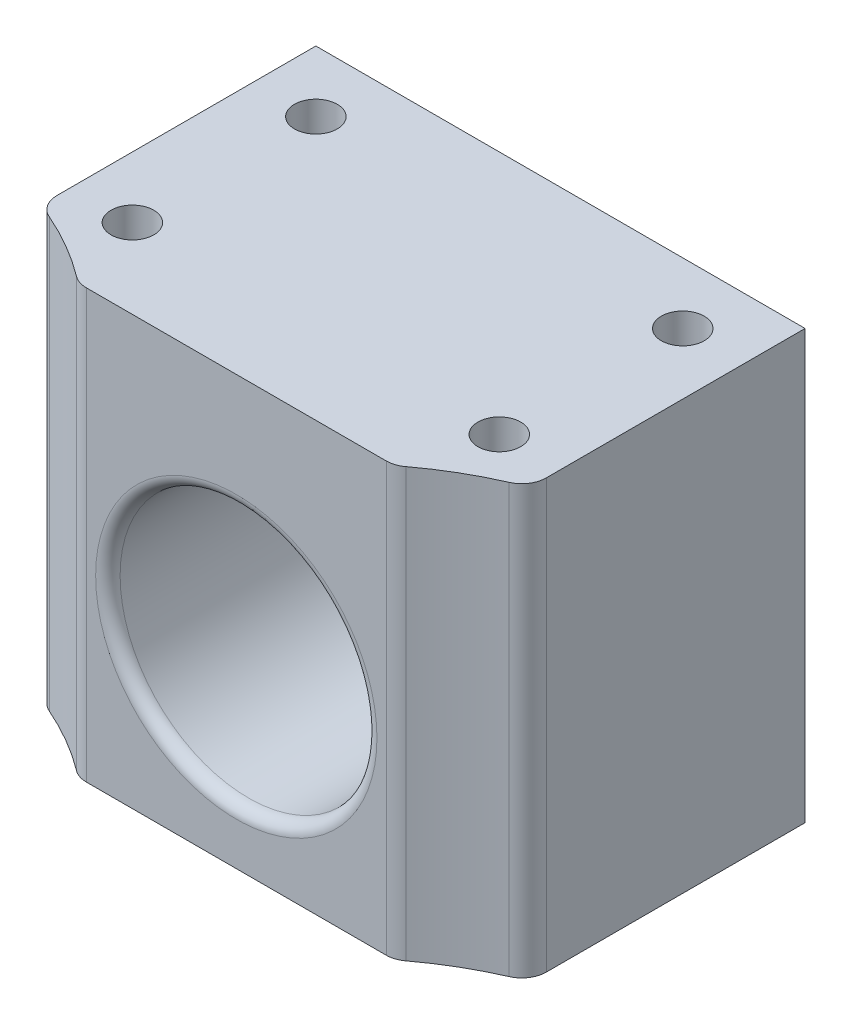
ISO-10303-21;
HEADER;
FILE_DESCRIPTION(('STEP AP214'),'2;1');
FILE_NAME('part.step','',(''),(''),'','','');
FILE_SCHEMA(('AUTOMOTIVE_DESIGN { 1 0 10303 214 1 1 1 1 }'));
ENDSEC;
DATA;
#1=APPLICATION_CONTEXT('core data for automotive mechanical design processes');
#2=APPLICATION_PROTOCOL_DEFINITION('international standard','automotive_design',2000,#1);
#3=PRODUCT_CONTEXT('',#1,'mechanical');
#4=PRODUCT('Part','Part','',(#3));
#5=PRODUCT_RELATED_PRODUCT_CATEGORY('part','',(#4));
#6=PRODUCT_DEFINITION_FORMATION('','',#4);
#7=PRODUCT_DEFINITION_CONTEXT('part definition',#1,'design');
#8=PRODUCT_DEFINITION('design','',#6,#7);
#9=PRODUCT_DEFINITION_SHAPE('','',#8);
#10=(LENGTH_UNIT() NAMED_UNIT(*) SI_UNIT(.MILLI.,.METRE.));
#11=(NAMED_UNIT(*) PLANE_ANGLE_UNIT() SI_UNIT($,.RADIAN.));
#12=(NAMED_UNIT(*) SI_UNIT($,.STERADIAN.) SOLID_ANGLE_UNIT());
#13=UNCERTAINTY_MEASURE_WITH_UNIT(LENGTH_MEASURE(1.E-05),#10,'distance_accuracy_value','');
#14=(GEOMETRIC_REPRESENTATION_CONTEXT(3) GLOBAL_UNCERTAINTY_ASSIGNED_CONTEXT((#13)) GLOBAL_UNIT_ASSIGNED_CONTEXT((#10,
#11,#12)) REPRESENTATION_CONTEXT('',''));
#15=CARTESIAN_POINT('',(0.,0.,0.));
#16=DIRECTION('',(0.,0.,1.));
#17=DIRECTION('',(1.,0.,0.));
#18=AXIS2_PLACEMENT_3D('',#15,#16,#17);
#19=CARTESIAN_POINT('',(-20.,35.,-13.25250025005));
#20=DIRECTION('',(0.,0.,1.));
#21=DIRECTION('',(1.,0.,0.));
#22=AXIS2_PLACEMENT_3D('',#19,#20,#21);
#23=PLANE('',#22);
#24=CARTESIAN_POINT('',(0.,15.,-13.25250025005));
#25=DIRECTION('',(0.,0.,1.));
#26=DIRECTION('',(1.,0.,0.));
#27=AXIS2_PLACEMENT_3D('',#24,#25,#26);
#28=CIRCLE('',#27,11.5);
#29=CARTESIAN_POINT('',(11.5,15.,-13.25250025005));
#30=VERTEX_POINT('',#29);
#31=EDGE_CURVE('E44',#30,#30,#28,.T.);
#32=ORIENTED_EDGE('',*,*,#31,.T.);
#33=EDGE_LOOP('',(#32));
#34=FACE_BOUND('',#33,.T.);
#35=DIRECTION('',(-1.,0.,0.));
#36=VECTOR('',#35,1.);
#37=CARTESIAN_POINT('',(-20.,0.,-13.25250025005));
#38=LINE('',#37,#36);
#39=CARTESIAN_POINT('',(20.,0.,-13.25250025005));
#40=VERTEX_POINT('',#39);
#41=CARTESIAN_POINT('',(-20.,0.,-13.25250025005));
#42=VERTEX_POINT('',#41);
#43=EDGE_CURVE('E145',#40,#42,#38,.T.);
#44=ORIENTED_EDGE('',*,*,#43,.T.);
#45=DIRECTION('',(0.,-1.,0.));
#46=VECTOR('',#45,1.);
#47=CARTESIAN_POINT('',(-20.,35.,-13.25250025005));
#48=LINE('',#47,#46);
#49=CARTESIAN_POINT('',(-20.,35.,-13.25250025005));
#50=VERTEX_POINT('',#49);
#51=EDGE_CURVE('E183',#50,#42,#48,.T.);
#52=ORIENTED_EDGE('',*,*,#51,.F.);
#53=DIRECTION('',(-1.,0.,0.));
#54=VECTOR('',#53,1.);
#55=CARTESIAN_POINT('',(-20.,35.,-13.25250025005));
#56=LINE('',#55,#54);
#57=CARTESIAN_POINT('',(20.,35.,-13.25250025005));
#58=VERTEX_POINT('',#57);
#59=EDGE_CURVE('E164',#58,#50,#56,.T.);
#60=ORIENTED_EDGE('',*,*,#59,.F.);
#61=DIRECTION('',(0.,-1.,0.));
#62=VECTOR('',#61,1.);
#63=CARTESIAN_POINT('',(20.,35.,-13.25250025005));
#64=LINE('',#63,#62);
#65=EDGE_CURVE('E141',#58,#40,#64,.T.);
#66=ORIENTED_EDGE('',*,*,#65,.T.);
#67=EDGE_LOOP('',(#44,#52,#60,#66));
#68=FACE_BOUND('',#67,.T.);
#69=ADVANCED_FACE('F35',(#34,#68),#23,.F.);
#70=CARTESIAN_POINT('',(-20.,35.,-13.25250025005));
#71=DIRECTION('',(1.,0.,0.));
#72=DIRECTION('',(0.,0.,-1.));
#73=AXIS2_PLACEMENT_3D('',#70,#71,#72);
#74=PLANE('',#73);
#75=DIRECTION('',(0.,0.,1.));
#76=VECTOR('',#75,1.);
#77=CARTESIAN_POINT('',(-20.,0.,-13.25250025005));
#78=LINE('',#77,#76);
#79=CARTESIAN_POINT('',(-20.,0.,7.90916389407314));
#80=VERTEX_POINT('',#79);
#81=EDGE_CURVE('E148',#42,#80,#78,.T.);
#82=ORIENTED_EDGE('',*,*,#81,.T.);
#83=DIRECTION('',(0.,-1.,0.));
#84=VECTOR('',#83,1.);
#85=CARTESIAN_POINT('',(-20.,35.,7.90916389407314));
#86=LINE('',#85,#84);
#87=CARTESIAN_POINT('',(-20.,35.,7.90916389407314));
#88=VERTEX_POINT('',#87);
#89=EDGE_CURVE('E180',#88,#80,#86,.T.);
#90=ORIENTED_EDGE('',*,*,#89,.F.);
#91=DIRECTION('',(0.,0.,1.));
#92=VECTOR('',#91,1.);
#93=CARTESIAN_POINT('',(-20.,35.,-13.25250025005));
#94=LINE('',#93,#92);
#95=EDGE_CURVE('E102',#50,#88,#94,.T.);
#96=ORIENTED_EDGE('',*,*,#95,.F.);
#97=ORIENTED_EDGE('',*,*,#51,.T.);
#98=EDGE_LOOP('',(#82,#90,#96,#97));
#99=FACE_BOUND('',#98,.T.);
#100=ADVANCED_FACE('F218',(#99),#74,.F.);
#101=CARTESIAN_POINT('',(-18.,35.,7.90916389407314));
#102=DIRECTION('',(0.,-1.,0.));
#103=DIRECTION('',(0.,0.,-1.));
#104=AXIS2_PLACEMENT_3D('',#101,#102,#103);
#105=CYLINDRICAL_SURFACE('',#104,2.);
#106=CARTESIAN_POINT('',(-18.,0.,7.90916389407314));
#107=DIRECTION('',(0.,1.,0.));
#108=DIRECTION('',(0.,0.,-1.));
#109=AXIS2_PLACEMENT_3D('',#106,#107,#108);
#110=CIRCLE('',#109,2.);
#111=CARTESIAN_POINT('',(-18.8002927285901,0.,9.74206638699681));
#112=VERTEX_POINT('',#111);
#113=EDGE_CURVE('E151',#80,#112,#110,.T.);
#114=ORIENTED_EDGE('',*,*,#113,.T.);
#115=DIRECTION('',(0.,-1.,0.));
#116=VECTOR('',#115,1.);
#117=CARTESIAN_POINT('',(-18.8002927285901,35.,9.74206638699681));
#118=LINE('',#117,#116);
#119=CARTESIAN_POINT('',(-18.8002927285901,35.,9.74206638699681));
#120=VERTEX_POINT('',#119);
#121=EDGE_CURVE('E177',#120,#112,#118,.T.);
#122=ORIENTED_EDGE('',*,*,#121,.F.);
#123=CARTESIAN_POINT('',(-18.,35.,7.90916389407314));
#124=DIRECTION('',(0.,1.,0.));
#125=DIRECTION('',(0.,0.,-1.));
#126=AXIS2_PLACEMENT_3D('',#123,#124,#125);
#127=CIRCLE('',#126,2.);
#128=EDGE_CURVE('E299',#88,#120,#127,.T.);
#129=ORIENTED_EDGE('',*,*,#128,.F.);
#130=ORIENTED_EDGE('',*,*,#89,.T.);
#131=EDGE_LOOP('',(#114,#122,#129,#130));
#132=FACE_BOUND('',#131,.T.);
#133=ADVANCED_FACE('F223',(#132),#105,.T.);
#134=CARTESIAN_POINT('',(-29.5,35.,34.24749974995));
#135=DIRECTION('',(0.,-1.,0.));
#136=DIRECTION('',(0.,0.,-1.));
#137=AXIS2_PLACEMENT_3D('',#134,#135,#136);
#138=CYLINDRICAL_SURFACE('',#137,26.7394839142419);
#139=CARTESIAN_POINT('',(-29.5,0.,34.24749974995));
#140=DIRECTION('',(0.,-1.,0.));
#141=DIRECTION('',(0.,0.,-1.));
#142=AXIS2_PLACEMENT_3D('',#139,#140,#141);
#143=CIRCLE('',#142,26.7394839142419);
#144=CARTESIAN_POINT('',(-13.4605437236197,0.,12.8527377190677));
#145=VERTEX_POINT('',#144);
#146=EDGE_CURVE('E153',#112,#145,#143,.T.);
#147=ORIENTED_EDGE('',*,*,#146,.T.);
#148=DIRECTION('',(0.,-1.,0.));
#149=VECTOR('',#148,1.);
#150=CARTESIAN_POINT('',(-13.4605437236197,35.,12.8527377190677));
#151=LINE('',#150,#149);
#152=CARTESIAN_POINT('',(-13.4605437236197,35.,12.8527377190677));
#153=VERTEX_POINT('',#152);
#154=EDGE_CURVE('E174',#153,#145,#151,.T.);
#155=ORIENTED_EDGE('',*,*,#154,.F.);
#156=CARTESIAN_POINT('',(-29.5,35.,34.24749974995));
#157=DIRECTION('',(0.,-1.,0.));
#158=DIRECTION('',(0.,0.,-1.));
#159=AXIS2_PLACEMENT_3D('',#156,#157,#158);
#160=CIRCLE('',#159,26.7394839142419);
#161=EDGE_CURVE('E301',#120,#153,#160,.T.);
#162=ORIENTED_EDGE('',*,*,#161,.F.);
#163=ORIENTED_EDGE('',*,*,#121,.T.);
#164=EDGE_LOOP('',(#147,#155,#162,#163));
#165=FACE_BOUND('',#164,.T.);
#166=ADVANCED_FACE('F228',(#165),#138,.F.);
#167=CARTESIAN_POINT('',(-12.2608604142617,35.,11.25250025005));
#168=DIRECTION('',(0.,-1.,0.));
#169=DIRECTION('',(0.,0.,-1.));
#170=AXIS2_PLACEMENT_3D('',#167,#168,#169);
#171=CYLINDRICAL_SURFACE('',#170,2.);
#172=CARTESIAN_POINT('',(-12.2608604142617,0.,11.25250025005));
#173=DIRECTION('',(0.,1.,0.));
#174=DIRECTION('',(0.,0.,-1.));
#175=AXIS2_PLACEMENT_3D('',#172,#173,#174);
#176=CIRCLE('',#175,2.);
#177=CARTESIAN_POINT('',(-12.2608604142617,0.,13.25250025005));
#178=VERTEX_POINT('',#177);
#179=EDGE_CURVE('E155',#145,#178,#176,.T.);
#180=ORIENTED_EDGE('',*,*,#179,.T.);
#181=DIRECTION('',(0.,-1.,0.));
#182=VECTOR('',#181,1.);
#183=CARTESIAN_POINT('',(-12.2608604142617,35.,13.25250025005));
#184=LINE('',#183,#182);
#185=CARTESIAN_POINT('',(-12.2608604142617,35.,13.25250025005));
#186=VERTEX_POINT('',#185);
#187=EDGE_CURVE('E171',#186,#178,#184,.T.);
#188=ORIENTED_EDGE('',*,*,#187,.F.);
#189=CARTESIAN_POINT('',(-12.2608604142617,35.,11.25250025005));
#190=DIRECTION('',(0.,1.,0.));
#191=DIRECTION('',(0.,0.,-1.));
#192=AXIS2_PLACEMENT_3D('',#189,#190,#191);
#193=CIRCLE('',#192,2.);
#194=EDGE_CURVE('E303',#153,#186,#193,.T.);
#195=ORIENTED_EDGE('',*,*,#194,.F.);
#196=ORIENTED_EDGE('',*,*,#154,.T.);
#197=EDGE_LOOP('',(#180,#188,#195,#196));
#198=FACE_BOUND('',#197,.T.);
#199=ADVANCED_FACE('F232',(#198),#171,.T.);
#200=CARTESIAN_POINT('',(12.2608604142617,35.,13.25250025005));
#201=DIRECTION('',(0.,0.,-1.));
#202=DIRECTION('',(-1.,0.,0.));
#203=AXIS2_PLACEMENT_3D('',#200,#201,#202);
#204=PLANE('',#203);
#205=CARTESIAN_POINT('',(0.,15.,13.25250025005));
#206=DIRECTION('',(0.,0.,-1.));
#207=DIRECTION('',(-1.,0.,0.));
#208=AXIS2_PLACEMENT_3D('',#205,#206,#207);
#209=CIRCLE('',#208,11.5);
#210=CARTESIAN_POINT('',(-11.5,15.,13.25250025005));
#211=VERTEX_POINT('',#210);
#212=EDGE_CURVE('E11',#211,#211,#209,.T.);
#213=ORIENTED_EDGE('',*,*,#212,.T.);
#214=EDGE_LOOP('',(#213));
#215=FACE_BOUND('',#214,.T.);
#216=DIRECTION('',(1.,0.,0.));
#217=VECTOR('',#216,1.);
#218=CARTESIAN_POINT('',(12.2608604142617,0.,13.25250025005));
#219=LINE('',#218,#217);
#220=CARTESIAN_POINT('',(12.2608604142617,0.,13.25250025005));
#221=VERTEX_POINT('',#220);
#222=EDGE_CURVE('E157',#178,#221,#219,.T.);
#223=ORIENTED_EDGE('',*,*,#222,.T.);
#224=DIRECTION('',(0.,-1.,0.));
#225=VECTOR('',#224,1.);
#226=CARTESIAN_POINT('',(12.2608604142617,35.,13.25250025005));
#227=LINE('',#226,#225);
#228=CARTESIAN_POINT('',(12.2608604142617,35.,13.25250025005));
#229=VERTEX_POINT('',#228);
#230=EDGE_CURVE('E168',#229,#221,#227,.T.);
#231=ORIENTED_EDGE('',*,*,#230,.F.);
#232=DIRECTION('',(1.,0.,0.));
#233=VECTOR('',#232,1.);
#234=CARTESIAN_POINT('',(12.2608604142617,35.,13.25250025005));
#235=LINE('',#234,#233);
#236=EDGE_CURVE('E305',#186,#229,#235,.T.);
#237=ORIENTED_EDGE('',*,*,#236,.F.);
#238=ORIENTED_EDGE('',*,*,#187,.T.);
#239=EDGE_LOOP('',(#223,#231,#237,#238));
#240=FACE_BOUND('',#239,.T.);
#241=ADVANCED_FACE('F236',(#215,#240),#204,.F.);
#242=CARTESIAN_POINT('',(12.2608604142617,35.,11.25250025005));
#243=DIRECTION('',(0.,-1.,0.));
#244=DIRECTION('',(0.,0.,-1.));
#245=AXIS2_PLACEMENT_3D('',#242,#243,#244);
#246=CYLINDRICAL_SURFACE('',#245,2.);
#247=CARTESIAN_POINT('',(12.2608604142617,0.,11.25250025005));
#248=DIRECTION('',(0.,1.,0.));
#249=DIRECTION('',(0.,0.,-1.));
#250=AXIS2_PLACEMENT_3D('',#247,#248,#249);
#251=CIRCLE('',#250,2.);
#252=CARTESIAN_POINT('',(13.4605437236197,0.,12.8527377190677));
#253=VERTEX_POINT('',#252);
#254=EDGE_CURVE('E159',#221,#253,#251,.T.);
#255=ORIENTED_EDGE('',*,*,#254,.T.);
#256=DIRECTION('',(0.,-1.,0.));
#257=VECTOR('',#256,1.);
#258=CARTESIAN_POINT('',(13.4605437236197,35.,12.8527377190677));
#259=LINE('',#258,#257);
#260=CARTESIAN_POINT('',(13.4605437236197,35.,12.8527377190677));
#261=VERTEX_POINT('',#260);
#262=EDGE_CURVE('E136',#261,#253,#259,.T.);
#263=ORIENTED_EDGE('',*,*,#262,.F.);
#264=CARTESIAN_POINT('',(12.2608604142617,35.,11.25250025005));
#265=DIRECTION('',(0.,1.,0.));
#266=DIRECTION('',(0.,0.,-1.));
#267=AXIS2_PLACEMENT_3D('',#264,#265,#266);
#268=CIRCLE('',#267,2.);
#269=EDGE_CURVE('E127',#229,#261,#268,.T.);
#270=ORIENTED_EDGE('',*,*,#269,.F.);
#271=ORIENTED_EDGE('',*,*,#230,.T.);
#272=EDGE_LOOP('',(#255,#263,#270,#271));
#273=FACE_BOUND('',#272,.T.);
#274=ADVANCED_FACE('F240',(#273),#246,.T.);
#275=CARTESIAN_POINT('',(29.5,35.,34.24749974995));
#276=DIRECTION('',(0.,-1.,0.));
#277=DIRECTION('',(0.,0.,-1.));
#278=AXIS2_PLACEMENT_3D('',#275,#276,#277);
#279=CYLINDRICAL_SURFACE('',#278,26.7394839142419);
#280=CARTESIAN_POINT('',(29.5,0.,34.24749974995));
#281=DIRECTION('',(0.,-1.,0.));
#282=DIRECTION('',(0.,0.,1.));
#283=AXIS2_PLACEMENT_3D('',#280,#281,#282);
#284=CIRCLE('',#283,26.7394839142419);
#285=CARTESIAN_POINT('',(18.8002927285901,0.,9.74206638699681));
#286=VERTEX_POINT('',#285);
#287=EDGE_CURVE('E135',#253,#286,#284,.T.);
#288=ORIENTED_EDGE('',*,*,#287,.T.);
#289=DIRECTION('',(0.,-1.,0.));
#290=VECTOR('',#289,1.);
#291=CARTESIAN_POINT('',(18.8002927285901,35.,9.74206638699681));
#292=LINE('',#291,#290);
#293=CARTESIAN_POINT('',(18.8002927285901,35.,9.74206638699681));
#294=VERTEX_POINT('',#293);
#295=EDGE_CURVE('E132',#294,#286,#292,.T.);
#296=ORIENTED_EDGE('',*,*,#295,.F.);
#297=CARTESIAN_POINT('',(29.5,35.,34.24749974995));
#298=DIRECTION('',(0.,-1.,0.));
#299=DIRECTION('',(0.,0.,1.));
#300=AXIS2_PLACEMENT_3D('',#297,#298,#299);
#301=CIRCLE('',#300,26.7394839142419);
#302=EDGE_CURVE('E121',#261,#294,#301,.T.);
#303=ORIENTED_EDGE('',*,*,#302,.F.);
#304=ORIENTED_EDGE('',*,*,#262,.T.);
#305=EDGE_LOOP('',(#288,#296,#303,#304));
#306=FACE_BOUND('',#305,.T.);
#307=ADVANCED_FACE('F133',(#306),#279,.F.);
#308=CARTESIAN_POINT('',(18.,35.,7.90916389407315));
#309=DIRECTION('',(0.,-1.,0.));
#310=DIRECTION('',(0.,0.,-1.));
#311=AXIS2_PLACEMENT_3D('',#308,#309,#310);
#312=CYLINDRICAL_SURFACE('',#311,2.);
#313=CARTESIAN_POINT('',(18.,0.,7.90916389407315));
#314=DIRECTION('',(0.,1.,0.));
#315=DIRECTION('',(0.,0.,1.));
#316=AXIS2_PLACEMENT_3D('',#313,#314,#315);
#317=CIRCLE('',#316,2.);
#318=CARTESIAN_POINT('',(20.,0.,7.90916389407315));
#319=VERTEX_POINT('',#318);
#320=EDGE_CURVE('E87',#286,#319,#317,.T.);
#321=ORIENTED_EDGE('',*,*,#320,.T.);
#322=DIRECTION('',(0.,-1.,0.));
#323=VECTOR('',#322,1.);
#324=CARTESIAN_POINT('',(20.,35.,7.90916389407315));
#325=LINE('',#324,#323);
#326=CARTESIAN_POINT('',(20.,35.,7.90916389407315));
#327=VERTEX_POINT('',#326);
#328=EDGE_CURVE('E137',#327,#319,#325,.T.);
#329=ORIENTED_EDGE('',*,*,#328,.F.);
#330=CARTESIAN_POINT('',(18.,35.,7.90916389407315));
#331=DIRECTION('',(0.,1.,0.));
#332=DIRECTION('',(0.,0.,1.));
#333=AXIS2_PLACEMENT_3D('',#330,#331,#332);
#334=CIRCLE('',#333,2.);
#335=EDGE_CURVE('E125',#294,#327,#334,.T.);
#336=ORIENTED_EDGE('',*,*,#335,.F.);
#337=ORIENTED_EDGE('',*,*,#295,.T.);
#338=EDGE_LOOP('',(#321,#329,#336,#337));
#339=FACE_BOUND('',#338,.T.);
#340=ADVANCED_FACE('F139',(#339),#312,.T.);
#341=CARTESIAN_POINT('',(20.,35.,-13.25250025005));
#342=DIRECTION('',(-1.,0.,0.));
#343=DIRECTION('',(0.,0.,1.));
#344=AXIS2_PLACEMENT_3D('',#341,#342,#343);
#345=PLANE('',#344);
#346=DIRECTION('',(0.,0.,-1.));
#347=VECTOR('',#346,1.);
#348=CARTESIAN_POINT('',(20.,0.,-13.25250025005));
#349=LINE('',#348,#347);
#350=EDGE_CURVE('E93',#319,#40,#349,.T.);
#351=ORIENTED_EDGE('',*,*,#350,.T.);
#352=ORIENTED_EDGE('',*,*,#65,.F.);
#353=DIRECTION('',(0.,0.,-1.));
#354=VECTOR('',#353,1.);
#355=CARTESIAN_POINT('',(20.,35.,-13.25250025005));
#356=LINE('',#355,#354);
#357=EDGE_CURVE('E52',#327,#58,#356,.T.);
#358=ORIENTED_EDGE('',*,*,#357,.F.);
#359=ORIENTED_EDGE('',*,*,#328,.T.);
#360=EDGE_LOOP('',(#351,#352,#358,#359));
#361=FACE_BOUND('',#360,.T.);
#362=ADVANCED_FACE('F249',(#361),#345,.F.);
#363=CARTESIAN_POINT('',(18.,35.,7.90916389407315));
#364=DIRECTION('',(0.,1.,0.));
#365=DIRECTION('',(0.,0.,1.));
#366=AXIS2_PLACEMENT_3D('',#363,#364,#365);
#367=PLANE('',#366);
#368=CARTESIAN_POINT('',(15.,35.,-8.25250025005001));
#369=DIRECTION('',(0.,1.,0.));
#370=DIRECTION('',(0.,0.,-1.));
#371=AXIS2_PLACEMENT_3D('',#368,#369,#370);
#372=CIRCLE('',#371,1.75);
#373=CARTESIAN_POINT('',(15.,35.,-10.00250025005));
#374=VERTEX_POINT('',#373);
#375=EDGE_CURVE('E276',#374,#374,#372,.T.);
#376=ORIENTED_EDGE('',*,*,#375,.F.);
#377=EDGE_LOOP('',(#376));
#378=FACE_BOUND('',#377,.T.);
#379=CARTESIAN_POINT('',(15.,35.,6.74749974994999));
#380=DIRECTION('',(0.,1.,0.));
#381=DIRECTION('',(0.,0.,-1.));
#382=AXIS2_PLACEMENT_3D('',#379,#380,#381);
#383=CIRCLE('',#382,1.75);
#384=CARTESIAN_POINT('',(15.,35.,4.99749974994999));
#385=VERTEX_POINT('',#384);
#386=EDGE_CURVE('E278',#385,#385,#383,.T.);
#387=ORIENTED_EDGE('',*,*,#386,.F.);
#388=EDGE_LOOP('',(#387));
#389=FACE_BOUND('',#388,.T.);
#390=CARTESIAN_POINT('',(-15.,35.,6.74749974994999));
#391=DIRECTION('',(0.,1.,0.));
#392=DIRECTION('',(0.,0.,1.));
#393=AXIS2_PLACEMENT_3D('',#390,#391,#392);
#394=CIRCLE('',#393,1.75);
#395=CARTESIAN_POINT('',(-15.,35.,8.49749974994999));
#396=VERTEX_POINT('',#395);
#397=EDGE_CURVE('E284',#396,#396,#394,.T.);
#398=ORIENTED_EDGE('',*,*,#397,.F.);
#399=EDGE_LOOP('',(#398));
#400=FACE_BOUND('',#399,.T.);
#401=CARTESIAN_POINT('',(-15.,35.,-8.25250025005001));
#402=DIRECTION('',(0.,1.,0.));
#403=DIRECTION('',(0.,0.,1.));
#404=AXIS2_PLACEMENT_3D('',#401,#402,#403);
#405=CIRCLE('',#404,1.75);
#406=CARTESIAN_POINT('',(-15.,35.,-6.50250025005001));
#407=VERTEX_POINT('',#406);
#408=EDGE_CURVE('E290',#407,#407,#405,.T.);
#409=ORIENTED_EDGE('',*,*,#408,.F.);
#410=EDGE_LOOP('',(#409));
#411=FACE_BOUND('',#410,.T.);
#412=ORIENTED_EDGE('',*,*,#59,.T.);
#413=ORIENTED_EDGE('',*,*,#95,.T.);
#414=ORIENTED_EDGE('',*,*,#128,.T.);
#415=ORIENTED_EDGE('',*,*,#161,.T.);
#416=ORIENTED_EDGE('',*,*,#194,.T.);
#417=ORIENTED_EDGE('',*,*,#236,.T.);
#418=ORIENTED_EDGE('',*,*,#269,.T.);
#419=ORIENTED_EDGE('',*,*,#302,.T.);
#420=ORIENTED_EDGE('',*,*,#335,.T.);
#421=ORIENTED_EDGE('',*,*,#357,.T.);
#422=EDGE_LOOP('',(#412,#413,#414,#415,#416,#417,#418,#419,#420,#421));
#423=FACE_BOUND('',#422,.T.);
#424=ADVANCED_FACE('F123',(#378,#389,#400,#411,#423),#367,.T.);
#425=CARTESIAN_POINT('',(18.,0.,7.90916389407315));
#426=DIRECTION('',(0.,1.,0.));
#427=DIRECTION('',(0.,0.,1.));
#428=AXIS2_PLACEMENT_3D('',#425,#426,#427);
#429=PLANE('',#428);
#430=CARTESIAN_POINT('',(15.,0.,-8.25250025005001));
#431=DIRECTION('',(0.,1.,0.));
#432=DIRECTION('',(0.,0.,-1.));
#433=AXIS2_PLACEMENT_3D('',#430,#431,#432);
#434=CIRCLE('',#433,1.75);
#435=CARTESIAN_POINT('',(15.,0.,-10.00250025005));
#436=VERTEX_POINT('',#435);
#437=EDGE_CURVE('E273',#436,#436,#434,.T.);
#438=ORIENTED_EDGE('',*,*,#437,.T.);
#439=EDGE_LOOP('',(#438));
#440=FACE_BOUND('',#439,.T.);
#441=CARTESIAN_POINT('',(15.,0.,6.74749974994999));
#442=DIRECTION('',(0.,1.,0.));
#443=DIRECTION('',(0.,0.,-1.));
#444=AXIS2_PLACEMENT_3D('',#441,#442,#443);
#445=CIRCLE('',#444,1.75);
#446=CARTESIAN_POINT('',(15.,0.,4.99749974994999));
#447=VERTEX_POINT('',#446);
#448=EDGE_CURVE('E281',#447,#447,#445,.T.);
#449=ORIENTED_EDGE('',*,*,#448,.T.);
#450=EDGE_LOOP('',(#449));
#451=FACE_BOUND('',#450,.T.);
#452=CARTESIAN_POINT('',(-15.,0.,6.74749974994999));
#453=DIRECTION('',(0.,1.,0.));
#454=DIRECTION('',(0.,0.,1.));
#455=AXIS2_PLACEMENT_3D('',#452,#453,#454);
#456=CIRCLE('',#455,1.75);
#457=CARTESIAN_POINT('',(-15.,0.,8.49749974994999));
#458=VERTEX_POINT('',#457);
#459=EDGE_CURVE('E287',#458,#458,#456,.T.);
#460=ORIENTED_EDGE('',*,*,#459,.T.);
#461=EDGE_LOOP('',(#460));
#462=FACE_BOUND('',#461,.T.);
#463=CARTESIAN_POINT('',(-15.,0.,-8.25250025005001));
#464=DIRECTION('',(0.,1.,0.));
#465=DIRECTION('',(0.,0.,1.));
#466=AXIS2_PLACEMENT_3D('',#463,#464,#465);
#467=CIRCLE('',#466,1.75);
#468=CARTESIAN_POINT('',(-15.,0.,-6.50250025005001));
#469=VERTEX_POINT('',#468);
#470=EDGE_CURVE('E149',#469,#469,#467,.T.);
#471=ORIENTED_EDGE('',*,*,#470,.T.);
#472=EDGE_LOOP('',(#471));
#473=FACE_BOUND('',#472,.T.);
#474=ORIENTED_EDGE('',*,*,#43,.F.);
#475=ORIENTED_EDGE('',*,*,#350,.F.);
#476=ORIENTED_EDGE('',*,*,#320,.F.);
#477=ORIENTED_EDGE('',*,*,#287,.F.);
#478=ORIENTED_EDGE('',*,*,#254,.F.);
#479=ORIENTED_EDGE('',*,*,#222,.F.);
#480=ORIENTED_EDGE('',*,*,#179,.F.);
#481=ORIENTED_EDGE('',*,*,#146,.F.);
#482=ORIENTED_EDGE('',*,*,#113,.F.);
#483=ORIENTED_EDGE('',*,*,#81,.F.);
#484=EDGE_LOOP('',(#474,#475,#476,#477,#478,#479,#480,#481,#482,#483));
#485=FACE_BOUND('',#484,.T.);
#486=ADVANCED_FACE('F203',(#440,#451,#462,#473,#485),#429,.F.);
#487=CARTESIAN_POINT('',(0.,15.,13.25350025005));
#488=DIRECTION('',(0.,0.,-1.));
#489=DIRECTION('',(-1.,0.,0.));
#490=AXIS2_PLACEMENT_3D('',#487,#488,#489);
#491=CYLINDRICAL_SURFACE('',#490,10.5);
#492=CARTESIAN_POINT('',(0.,15.,-12.25250025005));
#493=DIRECTION('',(0.,0.,1.));
#494=DIRECTION('',(1.,0.,0.));
#495=AXIS2_PLACEMENT_3D('',#492,#493,#494);
#496=CIRCLE('',#495,10.5);
#497=CARTESIAN_POINT('',(10.5,15.,-12.25250025005));
#498=VERTEX_POINT('',#497);
#499=EDGE_CURVE('E188',#498,#498,#496,.F.);
#500=ORIENTED_EDGE('',*,*,#499,.T.);
#501=EDGE_LOOP('',(#500));
#502=FACE_BOUND('',#501,.T.);
#503=CARTESIAN_POINT('',(0.,15.,12.25250025005));
#504=DIRECTION('',(0.,0.,-1.));
#505=DIRECTION('',(-1.,0.,0.));
#506=AXIS2_PLACEMENT_3D('',#503,#504,#505);
#507=CIRCLE('',#506,10.5);
#508=CARTESIAN_POINT('',(-10.5,15.,12.25250025005));
#509=VERTEX_POINT('',#508);
#510=EDGE_CURVE('E185',#509,#509,#507,.F.);
#511=ORIENTED_EDGE('',*,*,#510,.T.);
#512=EDGE_LOOP('',(#511));
#513=FACE_BOUND('',#512,.T.);
#514=ADVANCED_FACE('F198',(#502,#513),#491,.F.);
#515=CARTESIAN_POINT('',(0.,15.,-12.25250025005));
#516=DIRECTION('',(0.,0.,1.));
#517=DIRECTION('',(1.,0.,0.));
#518=AXIS2_PLACEMENT_3D('',#515,#516,#517);
#519=TOROIDAL_SURFACE('',#518,11.5,1.);
#520=ORIENTED_EDGE('',*,*,#31,.F.);
#521=EDGE_LOOP('',(#520));
#522=FACE_BOUND('',#521,.T.);
#523=ORIENTED_EDGE('',*,*,#499,.F.);
#524=EDGE_LOOP('',(#523));
#525=FACE_BOUND('',#524,.T.);
#526=ADVANCED_FACE('F195',(#522,#525),#519,.T.);
#527=CARTESIAN_POINT('',(0.,15.,12.25250025005));
#528=DIRECTION('',(0.,0.,-1.));
#529=DIRECTION('',(-1.,0.,0.));
#530=AXIS2_PLACEMENT_3D('',#527,#528,#529);
#531=TOROIDAL_SURFACE('',#530,11.5,1.);
#532=ORIENTED_EDGE('',*,*,#212,.F.);
#533=EDGE_LOOP('',(#532));
#534=FACE_BOUND('',#533,.T.);
#535=ORIENTED_EDGE('',*,*,#510,.F.);
#536=EDGE_LOOP('',(#535));
#537=FACE_BOUND('',#536,.T.);
#538=ADVANCED_FACE('F37',(#534,#537),#531,.T.);
#539=CARTESIAN_POINT('',(-15.,0.,-8.25250025005001));
#540=DIRECTION('',(0.,1.,0.));
#541=DIRECTION('',(0.,0.,1.));
#542=AXIS2_PLACEMENT_3D('',#539,#540,#541);
#543=CYLINDRICAL_SURFACE('',#542,1.75);
#544=ORIENTED_EDGE('',*,*,#470,.F.);
#545=EDGE_LOOP('',(#544));
#546=FACE_BOUND('',#545,.T.);
#547=ORIENTED_EDGE('',*,*,#408,.T.);
#548=EDGE_LOOP('',(#547));
#549=FACE_BOUND('',#548,.T.);
#550=ADVANCED_FACE('F208',(#546,#549),#543,.F.);
#551=CARTESIAN_POINT('',(-15.,0.,6.74749974994999));
#552=DIRECTION('',(0.,1.,0.));
#553=DIRECTION('',(0.,0.,1.));
#554=AXIS2_PLACEMENT_3D('',#551,#552,#553);
#555=CYLINDRICAL_SURFACE('',#554,1.75);
#556=ORIENTED_EDGE('',*,*,#459,.F.);
#557=EDGE_LOOP('',(#556));
#558=FACE_BOUND('',#557,.T.);
#559=ORIENTED_EDGE('',*,*,#397,.T.);
#560=EDGE_LOOP('',(#559));
#561=FACE_BOUND('',#560,.T.);
#562=ADVANCED_FACE('F213',(#558,#561),#555,.F.);
#563=CARTESIAN_POINT('',(15.,0.,6.74749974994999));
#564=DIRECTION('',(0.,1.,0.));
#565=DIRECTION('',(0.,0.,1.));
#566=AXIS2_PLACEMENT_3D('',#563,#564,#565);
#567=CYLINDRICAL_SURFACE('',#566,1.75);
#568=ORIENTED_EDGE('',*,*,#448,.F.);
#569=EDGE_LOOP('',(#568));
#570=FACE_BOUND('',#569,.T.);
#571=ORIENTED_EDGE('',*,*,#386,.T.);
#572=EDGE_LOOP('',(#571));
#573=FACE_BOUND('',#572,.T.);
#574=ADVANCED_FACE('F260',(#570,#573),#567,.F.);
#575=CARTESIAN_POINT('',(15.,0.,-8.25250025005001));
#576=DIRECTION('',(0.,1.,0.));
#577=DIRECTION('',(0.,0.,1.));
#578=AXIS2_PLACEMENT_3D('',#575,#576,#577);
#579=CYLINDRICAL_SURFACE('',#578,1.75);
#580=ORIENTED_EDGE('',*,*,#437,.F.);
#581=EDGE_LOOP('',(#580));
#582=FACE_BOUND('',#581,.T.);
#583=ORIENTED_EDGE('',*,*,#375,.T.);
#584=EDGE_LOOP('',(#583));
#585=FACE_BOUND('',#584,.T.);
#586=ADVANCED_FACE('F264',(#582,#585),#579,.F.);
#587=CLOSED_SHELL('',(#69,#100,#133,#166,#199,#241,#274,#307,#340,#362,#424,#486,#514,#526,#538,
#550,#562,#574,#586));
#588=MANIFOLD_SOLID_BREP('B2',#587);
#589=ADVANCED_BREP_SHAPE_REPRESENTATION('',(#18,#588),#14);
#590=SHAPE_DEFINITION_REPRESENTATION(#9,#589);
ENDSEC;
END-ISO-10303-21;
